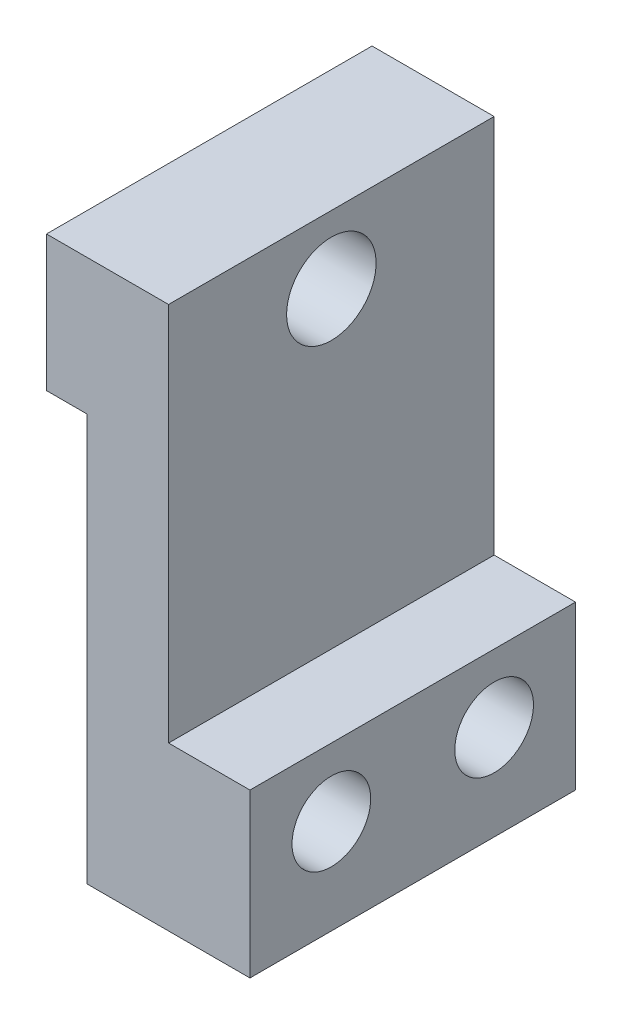
ISO-10303-21;
HEADER;
FILE_DESCRIPTION(('STEP AP214'),'2;1');
FILE_NAME('part.step','',(''),(''),'','','');
FILE_SCHEMA(('AUTOMOTIVE_DESIGN { 1 0 10303 214 1 1 1 1 }'));
ENDSEC;
DATA;
#1=APPLICATION_CONTEXT('core data for automotive mechanical design processes');
#2=APPLICATION_PROTOCOL_DEFINITION('international standard','automotive_design',2000,#1);
#3=PRODUCT_CONTEXT('',#1,'mechanical');
#4=PRODUCT('Part','Part','',(#3));
#5=PRODUCT_RELATED_PRODUCT_CATEGORY('part','',(#4));
#6=PRODUCT_DEFINITION_FORMATION('','',#4);
#7=PRODUCT_DEFINITION_CONTEXT('part definition',#1,'design');
#8=PRODUCT_DEFINITION('design','',#6,#7);
#9=PRODUCT_DEFINITION_SHAPE('','',#8);
#10=(LENGTH_UNIT() NAMED_UNIT(*) SI_UNIT(.MILLI.,.METRE.));
#11=(NAMED_UNIT(*) PLANE_ANGLE_UNIT() SI_UNIT($,.RADIAN.));
#12=(NAMED_UNIT(*) SI_UNIT($,.STERADIAN.) SOLID_ANGLE_UNIT());
#13=UNCERTAINTY_MEASURE_WITH_UNIT(LENGTH_MEASURE(1.E-05),#10,'distance_accuracy_value','');
#14=(GEOMETRIC_REPRESENTATION_CONTEXT(3) GLOBAL_UNCERTAINTY_ASSIGNED_CONTEXT((#13)) GLOBAL_UNIT_ASSIGNED_CONTEXT((#10,
#11,#12)) REPRESENTATION_CONTEXT('',''));
#15=CARTESIAN_POINT('',(0.,0.,0.));
#16=DIRECTION('',(0.,0.,1.));
#17=DIRECTION('',(1.,0.,0.));
#18=AXIS2_PLACEMENT_3D('',#15,#16,#17);
#19=CARTESIAN_POINT('',(0.,-0.868421052631572,12.));
#20=DIRECTION('',(-1.,0.,0.));
#21=DIRECTION('',(0.,-1.,0.));
#22=AXIS2_PLACEMENT_3D('',#19,#20,#21);
#23=PLANE('',#22);
#24=CARTESIAN_POINT('',(0.,-3.36842105263157,3.));
#25=DIRECTION('',(-1.,0.,0.));
#26=DIRECTION('',(0.,0.,1.));
#27=AXIS2_PLACEMENT_3D('',#24,#25,#26);
#28=CIRCLE('',#27,1.45);
#29=CARTESIAN_POINT('',(0.,-3.36842105263157,4.45));
#30=VERTEX_POINT('',#29);
#31=EDGE_CURVE('E182',#30,#30,#28,.T.);
#32=ORIENTED_EDGE('',*,*,#31,.T.);
#33=EDGE_LOOP('',(#32));
#34=FACE_BOUND('',#33,.T.);
#35=CARTESIAN_POINT('',(0.,-3.36842105263157,9.));
#36=DIRECTION('',(-1.,0.,0.));
#37=DIRECTION('',(0.,0.,1.));
#38=AXIS2_PLACEMENT_3D('',#35,#36,#37);
#39=CIRCLE('',#38,1.45);
#40=CARTESIAN_POINT('',(0.,-3.36842105263157,10.45));
#41=VERTEX_POINT('',#40);
#42=EDGE_CURVE('E133',#41,#41,#39,.T.);
#43=ORIENTED_EDGE('',*,*,#42,.T.);
#44=EDGE_LOOP('',(#43));
#45=FACE_BOUND('',#44,.T.);
#46=DIRECTION('',(0.,1.,0.));
#47=VECTOR('',#46,1.);
#48=CARTESIAN_POINT('',(0.,-0.868421052631572,0.));
#49=LINE('',#48,#47);
#50=CARTESIAN_POINT('',(0.,-6.86842105263157,0.));
#51=VERTEX_POINT('',#50);
#52=CARTESIAN_POINT('',(0.,-0.868421052631572,0.));
#53=VERTEX_POINT('',#52);
#54=EDGE_CURVE('E129',#51,#53,#49,.T.);
#55=ORIENTED_EDGE('',*,*,#54,.T.);
#56=DIRECTION('',(0.,0.,-1.));
#57=VECTOR('',#56,1.);
#58=CARTESIAN_POINT('',(0.,-0.868421052631572,12.));
#59=LINE('',#58,#57);
#60=CARTESIAN_POINT('',(0.,-0.868421052631572,12.));
#61=VERTEX_POINT('',#60);
#62=EDGE_CURVE('E11',#61,#53,#59,.T.);
#63=ORIENTED_EDGE('',*,*,#62,.F.);
#64=DIRECTION('',(0.,1.,0.));
#65=VECTOR('',#64,1.);
#66=CARTESIAN_POINT('',(0.,-0.868421052631572,12.));
#67=LINE('',#66,#65);
#68=CARTESIAN_POINT('',(0.,-6.86842105263157,12.));
#69=VERTEX_POINT('',#68);
#70=EDGE_CURVE('E144',#69,#61,#67,.T.);
#71=ORIENTED_EDGE('',*,*,#70,.F.);
#72=DIRECTION('',(0.,0.,-1.));
#73=VECTOR('',#72,1.);
#74=CARTESIAN_POINT('',(0.,-6.86842105263157,12.));
#75=LINE('',#74,#73);
#76=EDGE_CURVE('E125',#69,#51,#75,.T.);
#77=ORIENTED_EDGE('',*,*,#76,.T.);
#78=EDGE_LOOP('',(#55,#63,#71,#77));
#79=FACE_BOUND('',#78,.T.);
#80=ADVANCED_FACE('F33',(#34,#45,#79),#23,.F.);
#81=CARTESIAN_POINT('',(-3.,-0.868421052631572,12.));
#82=DIRECTION('',(0.,-1.,0.));
#83=DIRECTION('',(0.,0.,-1.));
#84=AXIS2_PLACEMENT_3D('',#81,#82,#83);
#85=PLANE('',#84);
#86=DIRECTION('',(-1.,0.,0.));
#87=VECTOR('',#86,1.);
#88=CARTESIAN_POINT('',(-3.,-0.868421052631572,0.));
#89=LINE('',#88,#87);
#90=CARTESIAN_POINT('',(-3.,-0.868421052631572,0.));
#91=VERTEX_POINT('',#90);
#92=EDGE_CURVE('E132',#53,#91,#89,.T.);
#93=ORIENTED_EDGE('',*,*,#92,.T.);
#94=DIRECTION('',(0.,0.,-1.));
#95=VECTOR('',#94,1.);
#96=CARTESIAN_POINT('',(-3.,-0.868421052631572,12.));
#97=LINE('',#96,#95);
#98=CARTESIAN_POINT('',(-3.,-0.868421052631572,12.));
#99=VERTEX_POINT('',#98);
#100=EDGE_CURVE('E41',#99,#91,#97,.T.);
#101=ORIENTED_EDGE('',*,*,#100,.F.);
#102=DIRECTION('',(-1.,0.,0.));
#103=VECTOR('',#102,1.);
#104=CARTESIAN_POINT('',(-3.,-0.868421052631572,12.));
#105=LINE('',#104,#103);
#106=EDGE_CURVE('E92',#61,#99,#105,.T.);
#107=ORIENTED_EDGE('',*,*,#106,.F.);
#108=ORIENTED_EDGE('',*,*,#62,.T.);
#109=EDGE_LOOP('',(#93,#101,#107,#108));
#110=FACE_BOUND('',#109,.T.);
#111=ADVANCED_FACE('F207',(#110),#85,.F.);
#112=CARTESIAN_POINT('',(-3.,13.1315789473684,12.));
#113=DIRECTION('',(-1.,0.,0.));
#114=DIRECTION('',(0.,-1.,0.));
#115=AXIS2_PLACEMENT_3D('',#112,#113,#114);
#116=PLANE('',#115);
#117=CARTESIAN_POINT('',(-3.,10.6315789473684,6.));
#118=DIRECTION('',(-1.,0.,0.));
#119=DIRECTION('',(0.,-1.,0.));
#120=AXIS2_PLACEMENT_3D('',#117,#118,#119);
#121=CIRCLE('',#120,1.65);
#122=CARTESIAN_POINT('',(-3.,8.98157894736843,6.));
#123=VERTEX_POINT('',#122);
#124=EDGE_CURVE('E188',#123,#123,#121,.T.);
#125=ORIENTED_EDGE('',*,*,#124,.T.);
#126=EDGE_LOOP('',(#125));
#127=FACE_BOUND('',#126,.T.);
#128=DIRECTION('',(0.,1.,0.));
#129=VECTOR('',#128,1.);
#130=CARTESIAN_POINT('',(-3.,13.1315789473684,0.));
#131=LINE('',#130,#129);
#132=CARTESIAN_POINT('',(-3.,13.1315789473684,0.));
#133=VERTEX_POINT('',#132);
#134=EDGE_CURVE('E135',#91,#133,#131,.T.);
#135=ORIENTED_EDGE('',*,*,#134,.T.);
#136=DIRECTION('',(0.,0.,-1.));
#137=VECTOR('',#136,1.);
#138=CARTESIAN_POINT('',(-3.,13.1315789473684,12.));
#139=LINE('',#138,#137);
#140=CARTESIAN_POINT('',(-3.,13.1315789473684,12.));
#141=VERTEX_POINT('',#140);
#142=EDGE_CURVE('E151',#141,#133,#139,.T.);
#143=ORIENTED_EDGE('',*,*,#142,.F.);
#144=DIRECTION('',(0.,1.,0.));
#145=VECTOR('',#144,1.);
#146=CARTESIAN_POINT('',(-3.,13.1315789473684,12.));
#147=LINE('',#146,#145);
#148=EDGE_CURVE('E159',#99,#141,#147,.T.);
#149=ORIENTED_EDGE('',*,*,#148,.F.);
#150=ORIENTED_EDGE('',*,*,#100,.T.);
#151=EDGE_LOOP('',(#135,#143,#149,#150));
#152=FACE_BOUND('',#151,.T.);
#153=ADVANCED_FACE('F157',(#127,#152),#116,.F.);
#154=CARTESIAN_POINT('',(-7.5,13.1315789473684,12.));
#155=DIRECTION('',(0.,-1.,0.));
#156=DIRECTION('',(0.,0.,-1.));
#157=AXIS2_PLACEMENT_3D('',#154,#155,#156);
#158=PLANE('',#157);
#159=DIRECTION('',(-1.,0.,0.));
#160=VECTOR('',#159,1.);
#161=CARTESIAN_POINT('',(-7.5,13.1315789473684,0.));
#162=LINE('',#161,#160);
#163=CARTESIAN_POINT('',(-7.5,13.1315789473684,0.));
#164=VERTEX_POINT('',#163);
#165=EDGE_CURVE('E137',#133,#164,#162,.T.);
#166=ORIENTED_EDGE('',*,*,#165,.T.);
#167=DIRECTION('',(0.,0.,-1.));
#168=VECTOR('',#167,1.);
#169=CARTESIAN_POINT('',(-7.5,13.1315789473684,12.));
#170=LINE('',#169,#168);
#171=CARTESIAN_POINT('',(-7.5,13.1315789473684,12.));
#172=VERTEX_POINT('',#171);
#173=EDGE_CURVE('E148',#172,#164,#170,.T.);
#174=ORIENTED_EDGE('',*,*,#173,.F.);
#175=DIRECTION('',(-1.,0.,0.));
#176=VECTOR('',#175,1.);
#177=CARTESIAN_POINT('',(-7.5,13.1315789473684,12.));
#178=LINE('',#177,#176);
#179=EDGE_CURVE('E171',#141,#172,#178,.T.);
#180=ORIENTED_EDGE('',*,*,#179,.F.);
#181=ORIENTED_EDGE('',*,*,#142,.T.);
#182=EDGE_LOOP('',(#166,#174,#180,#181));
#183=FACE_BOUND('',#182,.T.);
#184=ADVANCED_FACE('F167',(#183),#158,.F.);
#185=CARTESIAN_POINT('',(-7.5,8.13157894736843,12.));
#186=DIRECTION('',(1.,0.,0.));
#187=DIRECTION('',(0.,0.,-1.));
#188=AXIS2_PLACEMENT_3D('',#185,#186,#187);
#189=PLANE('',#188);
#190=CARTESIAN_POINT('',(-7.5,10.6315789473684,6.));
#191=DIRECTION('',(-1.,0.,0.));
#192=DIRECTION('',(0.,0.,1.));
#193=AXIS2_PLACEMENT_3D('',#190,#191,#192);
#194=CIRCLE('',#193,1.65);
#195=CARTESIAN_POINT('',(-7.5,10.6315789473684,7.65));
#196=VERTEX_POINT('',#195);
#197=EDGE_CURVE('E191',#196,#196,#194,.T.);
#198=ORIENTED_EDGE('',*,*,#197,.F.);
#199=EDGE_LOOP('',(#198));
#200=FACE_BOUND('',#199,.T.);
#201=DIRECTION('',(0.,-1.,0.));
#202=VECTOR('',#201,1.);
#203=CARTESIAN_POINT('',(-7.5,8.13157894736843,0.));
#204=LINE('',#203,#202);
#205=CARTESIAN_POINT('',(-7.5,8.13157894736843,0.));
#206=VERTEX_POINT('',#205);
#207=EDGE_CURVE('E139',#164,#206,#204,.T.);
#208=ORIENTED_EDGE('',*,*,#207,.T.);
#209=DIRECTION('',(0.,0.,-1.));
#210=VECTOR('',#209,1.);
#211=CARTESIAN_POINT('',(-7.5,8.13157894736843,12.));
#212=LINE('',#211,#210);
#213=CARTESIAN_POINT('',(-7.5,8.13157894736843,12.));
#214=VERTEX_POINT('',#213);
#215=EDGE_CURVE('E120',#214,#206,#212,.T.);
#216=ORIENTED_EDGE('',*,*,#215,.F.);
#217=DIRECTION('',(0.,-1.,0.));
#218=VECTOR('',#217,1.);
#219=CARTESIAN_POINT('',(-7.5,8.13157894736843,12.));
#220=LINE('',#219,#218);
#221=EDGE_CURVE('E111',#172,#214,#220,.T.);
#222=ORIENTED_EDGE('',*,*,#221,.F.);
#223=ORIENTED_EDGE('',*,*,#173,.T.);
#224=EDGE_LOOP('',(#208,#216,#222,#223));
#225=FACE_BOUND('',#224,.T.);
#226=ADVANCED_FACE('F170',(#200,#225),#189,.F.);
#227=CARTESIAN_POINT('',(-6.,8.13157894736843,12.));
#228=DIRECTION('',(0.,1.,0.));
#229=DIRECTION('',(-1.,0.,0.));
#230=AXIS2_PLACEMENT_3D('',#227,#228,#229);
#231=PLANE('',#230);
#232=DIRECTION('',(1.,0.,0.));
#233=VECTOR('',#232,1.);
#234=CARTESIAN_POINT('',(-6.,8.13157894736843,0.));
#235=LINE('',#234,#233);
#236=CARTESIAN_POINT('',(-6.,8.13157894736843,0.));
#237=VERTEX_POINT('',#236);
#238=EDGE_CURVE('E119',#206,#237,#235,.T.);
#239=ORIENTED_EDGE('',*,*,#238,.T.);
#240=DIRECTION('',(0.,0.,-1.));
#241=VECTOR('',#240,1.);
#242=CARTESIAN_POINT('',(-6.,8.13157894736843,12.));
#243=LINE('',#242,#241);
#244=CARTESIAN_POINT('',(-6.,8.13157894736843,12.));
#245=VERTEX_POINT('',#244);
#246=EDGE_CURVE('E116',#245,#237,#243,.T.);
#247=ORIENTED_EDGE('',*,*,#246,.F.);
#248=DIRECTION('',(1.,0.,0.));
#249=VECTOR('',#248,1.);
#250=CARTESIAN_POINT('',(-6.,8.13157894736843,12.));
#251=LINE('',#250,#249);
#252=EDGE_CURVE('E105',#214,#245,#251,.T.);
#253=ORIENTED_EDGE('',*,*,#252,.F.);
#254=ORIENTED_EDGE('',*,*,#215,.T.);
#255=EDGE_LOOP('',(#239,#247,#253,#254));
#256=FACE_BOUND('',#255,.T.);
#257=ADVANCED_FACE('F117',(#256),#231,.F.);
#258=CARTESIAN_POINT('',(-6.,-6.86842105263157,12.));
#259=DIRECTION('',(1.,0.,0.));
#260=DIRECTION('',(0.,0.,-1.));
#261=AXIS2_PLACEMENT_3D('',#258,#259,#260);
#262=PLANE('',#261);
#263=CARTESIAN_POINT('',(-6.,-3.36842105263157,3.));
#264=DIRECTION('',(-1.,0.,0.));
#265=DIRECTION('',(0.,0.,1.));
#266=AXIS2_PLACEMENT_3D('',#263,#264,#265);
#267=CIRCLE('',#266,1.45);
#268=CARTESIAN_POINT('',(-6.,-3.36842105263157,4.45));
#269=VERTEX_POINT('',#268);
#270=EDGE_CURVE('E185',#269,#269,#267,.T.);
#271=ORIENTED_EDGE('',*,*,#270,.F.);
#272=EDGE_LOOP('',(#271));
#273=FACE_BOUND('',#272,.T.);
#274=CARTESIAN_POINT('',(-6.,-3.36842105263157,9.));
#275=DIRECTION('',(-1.,0.,0.));
#276=DIRECTION('',(0.,0.,1.));
#277=AXIS2_PLACEMENT_3D('',#274,#275,#276);
#278=CIRCLE('',#277,1.45);
#279=CARTESIAN_POINT('',(-6.,-3.36842105263157,10.45));
#280=VERTEX_POINT('',#279);
#281=EDGE_CURVE('E179',#280,#280,#278,.T.);
#282=ORIENTED_EDGE('',*,*,#281,.F.);
#283=EDGE_LOOP('',(#282));
#284=FACE_BOUND('',#283,.T.);
#285=DIRECTION('',(0.,-1.,0.));
#286=VECTOR('',#285,1.);
#287=CARTESIAN_POINT('',(-6.,-6.86842105263157,0.));
#288=LINE('',#287,#286);
#289=CARTESIAN_POINT('',(-6.,-6.86842105263157,0.));
#290=VERTEX_POINT('',#289);
#291=EDGE_CURVE('E78',#237,#290,#288,.T.);
#292=ORIENTED_EDGE('',*,*,#291,.T.);
#293=DIRECTION('',(0.,0.,-1.));
#294=VECTOR('',#293,1.);
#295=CARTESIAN_POINT('',(-6.,-6.86842105263157,12.));
#296=LINE('',#295,#294);
#297=CARTESIAN_POINT('',(-6.,-6.86842105263157,12.));
#298=VERTEX_POINT('',#297);
#299=EDGE_CURVE('E121',#298,#290,#296,.T.);
#300=ORIENTED_EDGE('',*,*,#299,.F.);
#301=DIRECTION('',(0.,-1.,0.));
#302=VECTOR('',#301,1.);
#303=CARTESIAN_POINT('',(-6.,-6.86842105263157,12.));
#304=LINE('',#303,#302);
#305=EDGE_CURVE('E109',#245,#298,#304,.T.);
#306=ORIENTED_EDGE('',*,*,#305,.F.);
#307=ORIENTED_EDGE('',*,*,#246,.T.);
#308=EDGE_LOOP('',(#292,#300,#306,#307));
#309=FACE_BOUND('',#308,.T.);
#310=ADVANCED_FACE('F123',(#273,#284,#309),#262,.F.);
#311=CARTESIAN_POINT('',(0.,-6.86842105263157,12.));
#312=DIRECTION('',(0.,1.,0.));
#313=DIRECTION('',(-1.,0.,0.));
#314=AXIS2_PLACEMENT_3D('',#311,#312,#313);
#315=PLANE('',#314);
#316=DIRECTION('',(1.,0.,0.));
#317=VECTOR('',#316,1.);
#318=CARTESIAN_POINT('',(0.,-6.86842105263157,0.));
#319=LINE('',#318,#317);
#320=EDGE_CURVE('E84',#290,#51,#319,.T.);
#321=ORIENTED_EDGE('',*,*,#320,.T.);
#322=ORIENTED_EDGE('',*,*,#76,.F.);
#323=DIRECTION('',(1.,0.,0.));
#324=VECTOR('',#323,1.);
#325=CARTESIAN_POINT('',(0.,-6.86842105263157,12.));
#326=LINE('',#325,#324);
#327=EDGE_CURVE('E49',#298,#69,#326,.T.);
#328=ORIENTED_EDGE('',*,*,#327,.F.);
#329=ORIENTED_EDGE('',*,*,#299,.T.);
#330=EDGE_LOOP('',(#321,#322,#328,#329));
#331=FACE_BOUND('',#330,.T.);
#332=ADVANCED_FACE('F218',(#331),#315,.F.);
#333=CARTESIAN_POINT('',(0.,0.,12.));
#334=DIRECTION('',(0.,0.,-1.));
#335=DIRECTION('',(-1.,0.,0.));
#336=AXIS2_PLACEMENT_3D('',#333,#334,#335);
#337=PLANE('',#336);
#338=ORIENTED_EDGE('',*,*,#70,.T.);
#339=ORIENTED_EDGE('',*,*,#106,.T.);
#340=ORIENTED_EDGE('',*,*,#148,.T.);
#341=ORIENTED_EDGE('',*,*,#179,.T.);
#342=ORIENTED_EDGE('',*,*,#221,.T.);
#343=ORIENTED_EDGE('',*,*,#252,.T.);
#344=ORIENTED_EDGE('',*,*,#305,.T.);
#345=ORIENTED_EDGE('',*,*,#327,.T.);
#346=EDGE_LOOP('',(#338,#339,#340,#341,#342,#343,#344,#345));
#347=FACE_BOUND('',#346,.T.);
#348=ADVANCED_FACE('F107',(#347),#337,.F.);
#349=CARTESIAN_POINT('',(0.,0.,0.));
#350=DIRECTION('',(0.,0.,-1.));
#351=DIRECTION('',(-1.,0.,0.));
#352=AXIS2_PLACEMENT_3D('',#349,#350,#351);
#353=PLANE('',#352);
#354=ORIENTED_EDGE('',*,*,#54,.F.);
#355=ORIENTED_EDGE('',*,*,#320,.F.);
#356=ORIENTED_EDGE('',*,*,#291,.F.);
#357=ORIENTED_EDGE('',*,*,#238,.F.);
#358=ORIENTED_EDGE('',*,*,#207,.F.);
#359=ORIENTED_EDGE('',*,*,#165,.F.);
#360=ORIENTED_EDGE('',*,*,#134,.F.);
#361=ORIENTED_EDGE('',*,*,#92,.F.);
#362=EDGE_LOOP('',(#354,#355,#356,#357,#358,#359,#360,#361));
#363=FACE_BOUND('',#362,.T.);
#364=ADVANCED_FACE('F163',(#363),#353,.T.);
#365=CARTESIAN_POINT('',(-6.,-3.36842105263157,9.));
#366=DIRECTION('',(-1.,0.,0.));
#367=DIRECTION('',(0.,0.,1.));
#368=AXIS2_PLACEMENT_3D('',#365,#366,#367);
#369=CYLINDRICAL_SURFACE('',#368,1.45);
#370=ORIENTED_EDGE('',*,*,#42,.F.);
#371=EDGE_LOOP('',(#370));
#372=FACE_BOUND('',#371,.T.);
#373=ORIENTED_EDGE('',*,*,#281,.T.);
#374=EDGE_LOOP('',(#373));
#375=FACE_BOUND('',#374,.T.);
#376=ADVANCED_FACE('F230',(#372,#375),#369,.F.);
#377=CARTESIAN_POINT('',(-6.,-3.36842105263157,3.));
#378=DIRECTION('',(-1.,0.,0.));
#379=DIRECTION('',(0.,0.,1.));
#380=AXIS2_PLACEMENT_3D('',#377,#378,#379);
#381=CYLINDRICAL_SURFACE('',#380,1.45);
#382=ORIENTED_EDGE('',*,*,#31,.F.);
#383=EDGE_LOOP('',(#382));
#384=FACE_BOUND('',#383,.T.);
#385=ORIENTED_EDGE('',*,*,#270,.T.);
#386=EDGE_LOOP('',(#385));
#387=FACE_BOUND('',#386,.T.);
#388=ADVANCED_FACE('F234',(#384,#387),#381,.F.);
#389=CARTESIAN_POINT('',(-7.5,10.6315789473684,6.));
#390=DIRECTION('',(-1.,0.,0.));
#391=DIRECTION('',(0.,0.,1.));
#392=AXIS2_PLACEMENT_3D('',#389,#390,#391);
#393=CYLINDRICAL_SURFACE('',#392,1.65);
#394=ORIENTED_EDGE('',*,*,#197,.T.);
#395=EDGE_LOOP('',(#394));
#396=FACE_BOUND('',#395,.T.);
#397=ORIENTED_EDGE('',*,*,#124,.F.);
#398=EDGE_LOOP('',(#397));
#399=FACE_BOUND('',#398,.T.);
#400=ADVANCED_FACE('F195',(#396,#399),#393,.F.);
#401=CLOSED_SHELL('',(#80,#111,#153,#184,#226,#257,#310,#332,#348,#364,#376,#388,#400));
#402=MANIFOLD_SOLID_BREP('B2',#401);
#403=ADVANCED_BREP_SHAPE_REPRESENTATION('',(#18,#402),#14);
#404=SHAPE_DEFINITION_REPRESENTATION(#9,#403);
ENDSEC;
END-ISO-10303-21;
